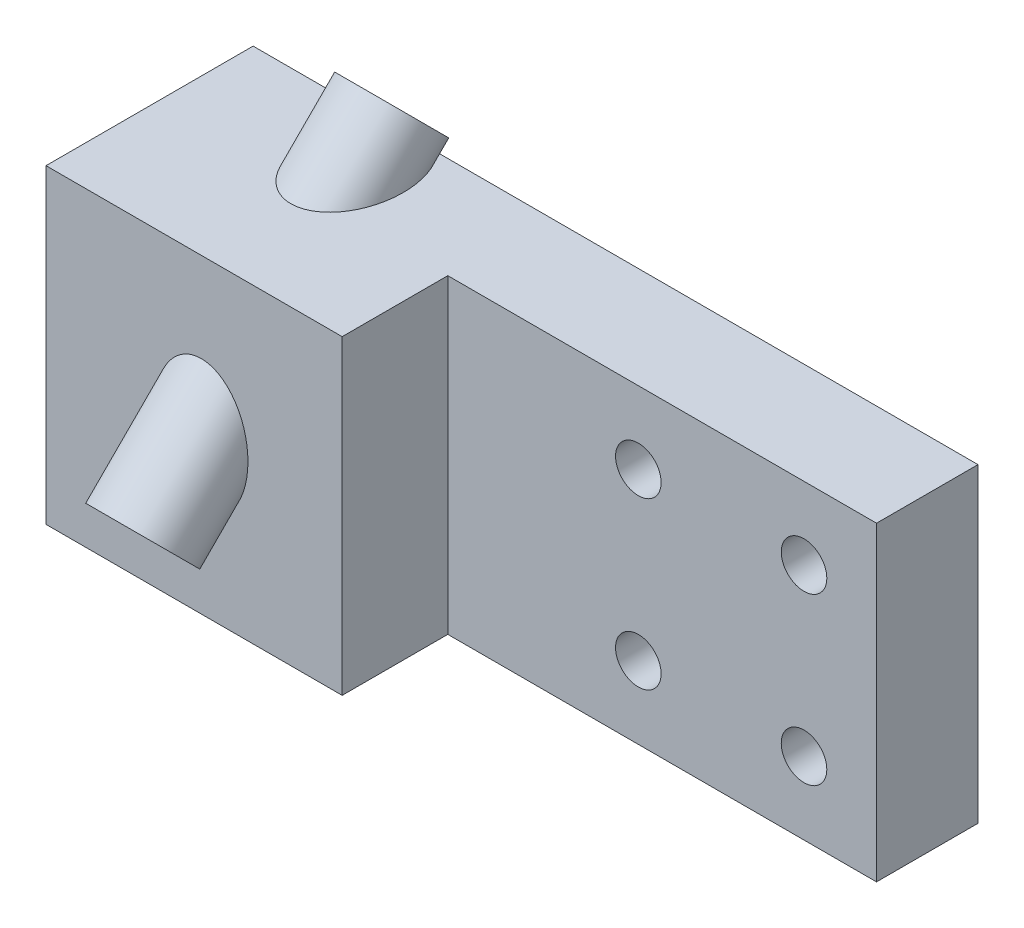
ISO-10303-21;
HEADER;
FILE_DESCRIPTION(('STEP AP214'),'2;1');
FILE_NAME('part.step','',(''),(''),'','','');
FILE_SCHEMA(('AUTOMOTIVE_DESIGN { 1 0 10303 214 1 1 1 1 }'));
ENDSEC;
DATA;
#1=APPLICATION_CONTEXT('core data for automotive mechanical design processes');
#2=APPLICATION_PROTOCOL_DEFINITION('international standard','automotive_design',2000,#1);
#3=PRODUCT_CONTEXT('',#1,'mechanical');
#4=PRODUCT('Part','Part','',(#3));
#5=PRODUCT_RELATED_PRODUCT_CATEGORY('part','',(#4));
#6=PRODUCT_DEFINITION_FORMATION('','',#4);
#7=PRODUCT_DEFINITION_CONTEXT('part definition',#1,'design');
#8=PRODUCT_DEFINITION('design','',#6,#7);
#9=PRODUCT_DEFINITION_SHAPE('','',#8);
#10=(LENGTH_UNIT() NAMED_UNIT(*) SI_UNIT(.MILLI.,.METRE.));
#11=(NAMED_UNIT(*) PLANE_ANGLE_UNIT() SI_UNIT($,.RADIAN.));
#12=(NAMED_UNIT(*) SI_UNIT($,.STERADIAN.) SOLID_ANGLE_UNIT());
#13=UNCERTAINTY_MEASURE_WITH_UNIT(LENGTH_MEASURE(1.E-05),#10,'distance_accuracy_value','');
#14=(GEOMETRIC_REPRESENTATION_CONTEXT(3) GLOBAL_UNCERTAINTY_ASSIGNED_CONTEXT((#13)) GLOBAL_UNIT_ASSIGNED_CONTEXT((#10,
#11,#12)) REPRESENTATION_CONTEXT('',''));
#15=CARTESIAN_POINT('',(0.,0.,0.));
#16=DIRECTION('',(0.,0.,1.));
#17=DIRECTION('',(1.,0.,0.));
#18=AXIS2_PLACEMENT_3D('',#15,#16,#17);
#19=CARTESIAN_POINT('',(0.,0.,4.));
#20=DIRECTION('',(0.,0.,1.));
#21=DIRECTION('',(1.,0.,0.));
#22=AXIS2_PLACEMENT_3D('',#19,#20,#21);
#23=PLANE('',#22);
#24=CARTESIAN_POINT('',(7.5,-7.5,4.));
#25=DIRECTION('',(0.,0.,1.));
#26=DIRECTION('',(0.,-1.,0.));
#27=AXIS2_PLACEMENT_3D('',#24,#25,#26);
#28=ELLIPSE('',#27,3.18198051533947,2.25);
#29=CARTESIAN_POINT('',(7.5,-10.6819805153395,4.));
#30=VERTEX_POINT('',#29);
#31=EDGE_CURVE('E11',#30,#30,#28,.T.);
#32=ORIENTED_EDGE('',*,*,#31,.F.);
#33=EDGE_LOOP('',(#32));
#34=FACE_BOUND('',#33,.T.);
#35=DIRECTION('',(1.,0.,0.));
#36=VECTOR('',#35,1.);
#37=CARTESIAN_POINT('',(0.,-15.,4.));
#38=LINE('',#37,#36);
#39=CARTESIAN_POINT('',(0.,-15.,4.));
#40=VERTEX_POINT('',#39);
#41=CARTESIAN_POINT('',(14.3,-15.,4.));
#42=VERTEX_POINT('',#41);
#43=EDGE_CURVE('E119',#40,#42,#38,.T.);
#44=ORIENTED_EDGE('',*,*,#43,.T.);
#45=DIRECTION('',(0.,-1.,0.));
#46=VECTOR('',#45,1.);
#47=CARTESIAN_POINT('',(14.3,0.,4.));
#48=LINE('',#47,#46);
#49=CARTESIAN_POINT('',(14.3,0.,4.));
#50=VERTEX_POINT('',#49);
#51=EDGE_CURVE('E110',#50,#42,#48,.T.);
#52=ORIENTED_EDGE('',*,*,#51,.F.);
#53=DIRECTION('',(-1.,0.,0.));
#54=VECTOR('',#53,1.);
#55=CARTESIAN_POINT('',(0.,0.,4.));
#56=LINE('',#55,#54);
#57=CARTESIAN_POINT('',(0.,0.,4.));
#58=VERTEX_POINT('',#57);
#59=EDGE_CURVE('E128',#50,#58,#56,.T.);
#60=ORIENTED_EDGE('',*,*,#59,.T.);
#61=DIRECTION('',(0.,-1.,0.));
#62=VECTOR('',#61,1.);
#63=CARTESIAN_POINT('',(0.,0.,4.));
#64=LINE('',#63,#62);
#65=EDGE_CURVE('E129',#58,#40,#64,.T.);
#66=ORIENTED_EDGE('',*,*,#65,.T.);
#67=EDGE_LOOP('',(#44,#52,#60,#66));
#68=FACE_BOUND('',#67,.T.);
#69=ADVANCED_FACE('F41',(#34,#68),#23,.T.);
#70=CARTESIAN_POINT('',(0.,0.,4.));
#71=DIRECTION('',(1.,0.,0.));
#72=DIRECTION('',(0.,1.,0.));
#73=AXIS2_PLACEMENT_3D('',#70,#71,#72);
#74=PLANE('',#73);
#75=DIRECTION('',(0.,0.,-1.));
#76=VECTOR('',#75,1.);
#77=CARTESIAN_POINT('',(0.,0.,4.));
#78=LINE('',#77,#76);
#79=CARTESIAN_POINT('',(0.,0.,-6.));
#80=VERTEX_POINT('',#79);
#81=EDGE_CURVE('E135',#58,#80,#78,.T.);
#82=ORIENTED_EDGE('',*,*,#81,.T.);
#83=DIRECTION('',(0.,-1.,0.));
#84=VECTOR('',#83,1.);
#85=CARTESIAN_POINT('',(0.,0.,-6.));
#86=LINE('',#85,#84);
#87=CARTESIAN_POINT('',(0.,-15.,-6.));
#88=VERTEX_POINT('',#87);
#89=EDGE_CURVE('E158',#80,#88,#86,.T.);
#90=ORIENTED_EDGE('',*,*,#89,.T.);
#91=DIRECTION('',(0.,0.,-1.));
#92=VECTOR('',#91,1.);
#93=CARTESIAN_POINT('',(0.,-15.,4.));
#94=LINE('',#93,#92);
#95=EDGE_CURVE('E139',#40,#88,#94,.T.);
#96=ORIENTED_EDGE('',*,*,#95,.F.);
#97=ORIENTED_EDGE('',*,*,#65,.F.);
#98=EDGE_LOOP('',(#82,#90,#96,#97));
#99=FACE_BOUND('',#98,.T.);
#100=ADVANCED_FACE('F43',(#99),#74,.F.);
#101=CARTESIAN_POINT('',(0.,-15.,4.));
#102=DIRECTION('',(0.,1.,0.));
#103=DIRECTION('',(0.,0.,1.));
#104=AXIS2_PLACEMENT_3D('',#101,#102,#103);
#105=PLANE('',#104);
#106=DIRECTION('',(1.,0.,0.));
#107=VECTOR('',#106,1.);
#108=CARTESIAN_POINT('',(0.,-15.,-1.1));
#109=LINE('',#108,#107);
#110=CARTESIAN_POINT('',(14.3,-15.,-1.1));
#111=VERTEX_POINT('',#110);
#112=CARTESIAN_POINT('',(35.,-15.,-1.1));
#113=VERTEX_POINT('',#112);
#114=EDGE_CURVE('E124',#111,#113,#109,.T.);
#115=ORIENTED_EDGE('',*,*,#114,.F.);
#116=DIRECTION('',(0.,0.,-1.));
#117=VECTOR('',#116,1.);
#118=CARTESIAN_POINT('',(14.3,-15.,4.));
#119=LINE('',#118,#117);
#120=EDGE_CURVE('E111',#42,#111,#119,.T.);
#121=ORIENTED_EDGE('',*,*,#120,.F.);
#122=ORIENTED_EDGE('',*,*,#43,.F.);
#123=ORIENTED_EDGE('',*,*,#95,.T.);
#124=DIRECTION('',(1.,0.,0.));
#125=VECTOR('',#124,1.);
#126=CARTESIAN_POINT('',(0.,-15.,-6.));
#127=LINE('',#126,#125);
#128=CARTESIAN_POINT('',(35.,-15.,-6.));
#129=VERTEX_POINT('',#128);
#130=EDGE_CURVE('E186',#88,#129,#127,.T.);
#131=ORIENTED_EDGE('',*,*,#130,.T.);
#132=DIRECTION('',(0.,0.,1.));
#133=VECTOR('',#132,1.);
#134=CARTESIAN_POINT('',(35.,-15.,-6.));
#135=LINE('',#134,#133);
#136=EDGE_CURVE('E178',#129,#113,#135,.T.);
#137=ORIENTED_EDGE('',*,*,#136,.T.);
#138=EDGE_LOOP('',(#115,#121,#122,#123,#131,#137));
#139=FACE_BOUND('',#138,.T.);
#140=ADVANCED_FACE('F118',(#139),#105,.F.);
#141=CARTESIAN_POINT('',(0.,0.,4.));
#142=DIRECTION('',(0.,-1.,0.));
#143=DIRECTION('',(0.,0.,-1.));
#144=AXIS2_PLACEMENT_3D('',#141,#142,#143);
#145=PLANE('',#144);
#146=DIRECTION('',(0.,0.,1.));
#147=VECTOR('',#146,1.);
#148=CARTESIAN_POINT('',(14.3,0.,4.));
#149=LINE('',#148,#147);
#150=CARTESIAN_POINT('',(14.3,0.,-1.1));
#151=VERTEX_POINT('',#150);
#152=EDGE_CURVE('E113',#151,#50,#149,.T.);
#153=ORIENTED_EDGE('',*,*,#152,.F.);
#154=DIRECTION('',(1.,0.,0.));
#155=VECTOR('',#154,1.);
#156=CARTESIAN_POINT('',(0.,0.,-1.1));
#157=LINE('',#156,#155);
#158=CARTESIAN_POINT('',(35.,0.,-1.1));
#159=VERTEX_POINT('',#158);
#160=EDGE_CURVE('E150',#151,#159,#157,.T.);
#161=ORIENTED_EDGE('',*,*,#160,.T.);
#162=DIRECTION('',(0.,0.,1.));
#163=VECTOR('',#162,1.);
#164=CARTESIAN_POINT('',(35.,0.,-6.));
#165=LINE('',#164,#163);
#166=CARTESIAN_POINT('',(35.,0.,-6.));
#167=VERTEX_POINT('',#166);
#168=EDGE_CURVE('E133',#167,#159,#165,.T.);
#169=ORIENTED_EDGE('',*,*,#168,.F.);
#170=DIRECTION('',(-1.,0.,0.));
#171=VECTOR('',#170,1.);
#172=CARTESIAN_POINT('',(0.,0.,-6.));
#173=LINE('',#172,#171);
#174=CARTESIAN_POINT('',(8.89194109070747,0.,-6.));
#175=VERTEX_POINT('',#174);
#176=EDGE_CURVE('E167',#167,#175,#173,.T.);
#177=ORIENTED_EDGE('',*,*,#176,.T.);
#178=CARTESIAN_POINT('',(7.5,0.,-3.49999999999997));
#179=DIRECTION('',(0.,-1.,0.));
#180=DIRECTION('',(0.,0.,1.));
#181=AXIS2_PLACEMENT_3D('',#178,#179,#180);
#182=ELLIPSE('',#181,3.18198051533946,2.25);
#183=CARTESIAN_POINT('',(6.10805890929252,0.,-6.));
#184=VERTEX_POINT('',#183);
#185=EDGE_CURVE('E57',#175,#184,#182,.T.);
#186=ORIENTED_EDGE('',*,*,#185,.T.);
#187=EDGE_CURVE('E175',#184,#80,#173,.T.);
#188=ORIENTED_EDGE('',*,*,#187,.T.);
#189=ORIENTED_EDGE('',*,*,#81,.F.);
#190=ORIENTED_EDGE('',*,*,#59,.F.);
#191=EDGE_LOOP('',(#153,#161,#169,#177,#186,#188,#189,#190));
#192=FACE_BOUND('',#191,.T.);
#193=ADVANCED_FACE('F172',(#192),#145,.F.);
#194=CARTESIAN_POINT('',(35.,0.,-6.));
#195=DIRECTION('',(1.,0.,0.));
#196=DIRECTION('',(0.,0.,-1.));
#197=AXIS2_PLACEMENT_3D('',#194,#195,#196);
#198=PLANE('',#197);
#199=DIRECTION('',(0.,-1.,0.));
#200=VECTOR('',#199,1.);
#201=CARTESIAN_POINT('',(35.,14.,-1.1));
#202=LINE('',#201,#200);
#203=EDGE_CURVE('E159',#159,#113,#202,.T.);
#204=ORIENTED_EDGE('',*,*,#203,.T.);
#205=ORIENTED_EDGE('',*,*,#136,.F.);
#206=DIRECTION('',(0.,1.,0.));
#207=VECTOR('',#206,1.);
#208=CARTESIAN_POINT('',(35.,0.,-6.));
#209=LINE('',#208,#207);
#210=EDGE_CURVE('E179',#129,#167,#209,.T.);
#211=ORIENTED_EDGE('',*,*,#210,.T.);
#212=ORIENTED_EDGE('',*,*,#168,.T.);
#213=EDGE_LOOP('',(#204,#205,#211,#212));
#214=FACE_BOUND('',#213,.T.);
#215=ADVANCED_FACE('F187',(#214),#198,.T.);
#216=CARTESIAN_POINT('',(0.,0.,-6.));
#217=DIRECTION('',(0.,0.,1.));
#218=DIRECTION('',(1.,0.,0.));
#219=AXIS2_PLACEMENT_3D('',#216,#217,#218);
#220=PLANE('',#219);
#221=CARTESIAN_POINT('',(23.5,-3.50000000000005,-6.));
#222=DIRECTION('',(0.,0.,1.));
#223=DIRECTION('',(1.,0.,0.));
#224=AXIS2_PLACEMENT_3D('',#221,#222,#223);
#225=CIRCLE('',#224,1.1);
#226=CARTESIAN_POINT('',(24.6,-3.50000000000005,-6.));
#227=VERTEX_POINT('',#226);
#228=EDGE_CURVE('E152',#227,#227,#225,.T.);
#229=ORIENTED_EDGE('',*,*,#228,.T.);
#230=EDGE_LOOP('',(#229));
#231=FACE_BOUND('',#230,.T.);
#232=CARTESIAN_POINT('',(23.5000000000001,-11.5000000000001,-6.));
#233=DIRECTION('',(0.,0.,1.));
#234=DIRECTION('',(1.,0.,0.));
#235=AXIS2_PLACEMENT_3D('',#232,#233,#234);
#236=CIRCLE('',#235,1.1);
#237=CARTESIAN_POINT('',(24.6000000000001,-11.5000000000001,-6.));
#238=VERTEX_POINT('',#237);
#239=EDGE_CURVE('E148',#238,#238,#236,.T.);
#240=ORIENTED_EDGE('',*,*,#239,.T.);
#241=EDGE_LOOP('',(#240));
#242=FACE_BOUND('',#241,.T.);
#243=CARTESIAN_POINT('',(31.5000000000001,-11.5,-6.));
#244=DIRECTION('',(0.,0.,1.));
#245=DIRECTION('',(1.,0.,0.));
#246=AXIS2_PLACEMENT_3D('',#243,#244,#245);
#247=CIRCLE('',#246,1.1);
#248=CARTESIAN_POINT('',(32.6000000000001,-11.5,-6.));
#249=VERTEX_POINT('',#248);
#250=EDGE_CURVE('E147',#249,#249,#247,.T.);
#251=ORIENTED_EDGE('',*,*,#250,.T.);
#252=EDGE_LOOP('',(#251));
#253=FACE_BOUND('',#252,.T.);
#254=CARTESIAN_POINT('',(31.5,-3.5,-6.));
#255=DIRECTION('',(0.,0.,1.));
#256=DIRECTION('',(1.,0.,0.));
#257=AXIS2_PLACEMENT_3D('',#254,#255,#256);
#258=CIRCLE('',#257,1.1);
#259=CARTESIAN_POINT('',(32.6,-3.5,-6.));
#260=VERTEX_POINT('',#259);
#261=EDGE_CURVE('E141',#260,#260,#258,.T.);
#262=ORIENTED_EDGE('',*,*,#261,.T.);
#263=EDGE_LOOP('',(#262));
#264=FACE_BOUND('',#263,.T.);
#265=ORIENTED_EDGE('',*,*,#187,.F.);
#266=CARTESIAN_POINT('',(7.5,2.50000000000003,-6.));
#267=DIRECTION('',(0.,0.,1.));
#268=DIRECTION('',(0.,-1.,0.));
#269=AXIS2_PLACEMENT_3D('',#266,#267,#268);
#270=ELLIPSE('',#269,3.18198051533947,2.25);
#271=EDGE_CURVE('E44',#184,#175,#270,.T.);
#272=ORIENTED_EDGE('',*,*,#271,.T.);
#273=ORIENTED_EDGE('',*,*,#176,.F.);
#274=ORIENTED_EDGE('',*,*,#210,.F.);
#275=ORIENTED_EDGE('',*,*,#130,.F.);
#276=ORIENTED_EDGE('',*,*,#89,.F.);
#277=EDGE_LOOP('',(#265,#272,#273,#274,#275,#276));
#278=FACE_BOUND('',#277,.T.);
#279=ADVANCED_FACE('F166',(#231,#242,#253,#264,#278),#220,.F.);
#280=CARTESIAN_POINT('',(31.5,-3.5,-25.));
#281=DIRECTION('',(0.,0.,1.));
#282=DIRECTION('',(1.,0.,0.));
#283=AXIS2_PLACEMENT_3D('',#280,#281,#282);
#284=CYLINDRICAL_SURFACE('',#283,1.1);
#285=CARTESIAN_POINT('',(31.5,-3.5,-1.1));
#286=DIRECTION('',(0.,0.,-1.));
#287=DIRECTION('',(-1.,0.,0.));
#288=AXIS2_PLACEMENT_3D('',#285,#286,#287);
#289=CIRCLE('',#288,1.1);
#290=CARTESIAN_POINT('',(30.4,-3.5,-1.1));
#291=VERTEX_POINT('',#290);
#292=EDGE_CURVE('E191',#291,#291,#289,.F.);
#293=ORIENTED_EDGE('',*,*,#292,.T.);
#294=EDGE_LOOP('',(#293));
#295=FACE_BOUND('',#294,.T.);
#296=ORIENTED_EDGE('',*,*,#261,.F.);
#297=EDGE_LOOP('',(#296));
#298=FACE_BOUND('',#297,.T.);
#299=ADVANCED_FACE('F285',(#295,#298),#284,.F.);
#300=CARTESIAN_POINT('',(31.5000000000001,-11.5,-25.));
#301=DIRECTION('',(0.,0.,1.));
#302=DIRECTION('',(1.,0.,0.));
#303=AXIS2_PLACEMENT_3D('',#300,#301,#302);
#304=CYLINDRICAL_SURFACE('',#303,1.1);
#305=CARTESIAN_POINT('',(31.5000000000001,-11.5,-1.1));
#306=DIRECTION('',(0.,0.,-1.));
#307=DIRECTION('',(-1.,0.,0.));
#308=AXIS2_PLACEMENT_3D('',#305,#306,#307);
#309=CIRCLE('',#308,1.1);
#310=CARTESIAN_POINT('',(30.4000000000001,-11.5,-1.1));
#311=VERTEX_POINT('',#310);
#312=EDGE_CURVE('E200',#311,#311,#309,.F.);
#313=ORIENTED_EDGE('',*,*,#312,.T.);
#314=EDGE_LOOP('',(#313));
#315=FACE_BOUND('',#314,.T.);
#316=ORIENTED_EDGE('',*,*,#250,.F.);
#317=EDGE_LOOP('',(#316));
#318=FACE_BOUND('',#317,.T.);
#319=ADVANCED_FACE('F279',(#315,#318),#304,.F.);
#320=CARTESIAN_POINT('',(23.5000000000001,-11.5000000000001,-25.));
#321=DIRECTION('',(0.,0.,1.));
#322=DIRECTION('',(1.,0.,0.));
#323=AXIS2_PLACEMENT_3D('',#320,#321,#322);
#324=CYLINDRICAL_SURFACE('',#323,1.1);
#325=CARTESIAN_POINT('',(23.5000000000001,-11.5000000000001,-1.1));
#326=DIRECTION('',(0.,0.,-1.));
#327=DIRECTION('',(-1.,0.,0.));
#328=AXIS2_PLACEMENT_3D('',#325,#326,#327);
#329=CIRCLE('',#328,1.1);
#330=CARTESIAN_POINT('',(22.4000000000001,-11.5000000000001,-1.1));
#331=VERTEX_POINT('',#330);
#332=EDGE_CURVE('E157',#331,#331,#329,.F.);
#333=ORIENTED_EDGE('',*,*,#332,.T.);
#334=EDGE_LOOP('',(#333));
#335=FACE_BOUND('',#334,.T.);
#336=ORIENTED_EDGE('',*,*,#239,.F.);
#337=EDGE_LOOP('',(#336));
#338=FACE_BOUND('',#337,.T.);
#339=ADVANCED_FACE('F281',(#335,#338),#324,.F.);
#340=CARTESIAN_POINT('',(23.5,-3.50000000000005,-25.));
#341=DIRECTION('',(0.,0.,1.));
#342=DIRECTION('',(1.,0.,0.));
#343=AXIS2_PLACEMENT_3D('',#340,#341,#342);
#344=CYLINDRICAL_SURFACE('',#343,1.1);
#345=CARTESIAN_POINT('',(23.5,-3.50000000000005,-1.1));
#346=DIRECTION('',(0.,0.,-1.));
#347=DIRECTION('',(-1.,0.,0.));
#348=AXIS2_PLACEMENT_3D('',#345,#346,#347);
#349=CIRCLE('',#348,1.1);
#350=CARTESIAN_POINT('',(22.4,-3.50000000000005,-1.1));
#351=VERTEX_POINT('',#350);
#352=EDGE_CURVE('E160',#351,#351,#349,.F.);
#353=ORIENTED_EDGE('',*,*,#352,.T.);
#354=EDGE_LOOP('',(#353));
#355=FACE_BOUND('',#354,.T.);
#356=ORIENTED_EDGE('',*,*,#228,.F.);
#357=EDGE_LOOP('',(#356));
#358=FACE_BOUND('',#357,.T.);
#359=ADVANCED_FACE('F277',(#355,#358),#344,.F.);
#360=CARTESIAN_POINT('',(0.,14.,-1.1));
#361=DIRECTION('',(0.,0.,-1.));
#362=DIRECTION('',(-1.,0.,0.));
#363=AXIS2_PLACEMENT_3D('',#360,#361,#362);
#364=PLANE('',#363);
#365=ORIENTED_EDGE('',*,*,#312,.F.);
#366=EDGE_LOOP('',(#365));
#367=FACE_BOUND('',#366,.T.);
#368=ORIENTED_EDGE('',*,*,#352,.F.);
#369=EDGE_LOOP('',(#368));
#370=FACE_BOUND('',#369,.T.);
#371=ORIENTED_EDGE('',*,*,#332,.F.);
#372=EDGE_LOOP('',(#371));
#373=FACE_BOUND('',#372,.T.);
#374=ORIENTED_EDGE('',*,*,#292,.F.);
#375=EDGE_LOOP('',(#374));
#376=FACE_BOUND('',#375,.T.);
#377=ORIENTED_EDGE('',*,*,#160,.F.);
#378=DIRECTION('',(0.,1.,0.));
#379=VECTOR('',#378,1.);
#380=CARTESIAN_POINT('',(14.3,0.,-1.1));
#381=LINE('',#380,#379);
#382=EDGE_CURVE('E123',#111,#151,#381,.T.);
#383=ORIENTED_EDGE('',*,*,#382,.F.);
#384=ORIENTED_EDGE('',*,*,#114,.T.);
#385=ORIENTED_EDGE('',*,*,#203,.F.);
#386=EDGE_LOOP('',(#377,#383,#384,#385));
#387=FACE_BOUND('',#386,.T.);
#388=ADVANCED_FACE('F272',(#367,#370,#373,#376,#387),#364,.F.);
#389=CARTESIAN_POINT('',(7.5,1.69238815542513,-5.1923881554251));
#390=DIRECTION('',(0.,-0.707106781186549,0.707106781186546));
#391=DIRECTION('',(0.,-0.707106781186546,-0.707106781186549));
#392=AXIS2_PLACEMENT_3D('',#389,#390,#391);
#393=PLANE('',#392);
#394=CARTESIAN_POINT('',(7.5,1.69238815542513,-5.1923881554251));
#395=DIRECTION('',(0.,-0.707106781186549,0.707106781186546));
#396=DIRECTION('',(0.,-0.707106781186546,-0.707106781186549));
#397=AXIS2_PLACEMENT_3D('',#394,#395,#396);
#398=CIRCLE('',#397,1.5);
#399=CARTESIAN_POINT('',(7.5,0.631727983645316,-6.25304832720492));
#400=VERTEX_POINT('',#399);
#401=EDGE_CURVE('E212',#400,#400,#398,.T.);
#402=ORIENTED_EDGE('',*,*,#401,.T.);
#403=EDGE_LOOP('',(#402));
#404=FACE_BOUND('',#403,.T.);
#405=CARTESIAN_POINT('',(7.5,1.69238815542513,-5.1923881554251));
#406=DIRECTION('',(0.,-0.707106781186549,0.707106781186546));
#407=DIRECTION('',(0.,-0.707106781186546,-0.707106781186549));
#408=AXIS2_PLACEMENT_3D('',#405,#406,#407);
#409=CIRCLE('',#408,2.25);
#410=CARTESIAN_POINT('',(7.5,0.101397897755405,-6.78337841309484));
#411=VERTEX_POINT('',#410);
#412=EDGE_CURVE('E206',#411,#411,#409,.T.);
#413=ORIENTED_EDGE('',*,*,#412,.F.);
#414=EDGE_LOOP('',(#413));
#415=FACE_BOUND('',#414,.T.);
#416=ADVANCED_FACE('F247',(#404,#415),#393,.F.);
#417=CARTESIAN_POINT('',(7.5,1.69238815542513,-5.1923881554251));
#418=DIRECTION('',(0.,-0.707106781186549,0.707106781186546));
#419=DIRECTION('',(0.,-0.707106781186546,-0.707106781186549));
#420=AXIS2_PLACEMENT_3D('',#417,#418,#419);
#421=CYLINDRICAL_SURFACE('',#420,2.25);
#422=ORIENTED_EDGE('',*,*,#412,.T.);
#423=EDGE_LOOP('',(#422));
#424=FACE_BOUND('',#423,.T.);
#425=ORIENTED_EDGE('',*,*,#185,.F.);
#426=ORIENTED_EDGE('',*,*,#271,.F.);
#427=EDGE_LOOP('',(#425,#426));
#428=FACE_BOUND('',#427,.T.);
#429=ADVANCED_FACE('F241',(#424,#428),#421,.T.);
#430=DIRECTION('',(1.,0.,0.));
#431=VECTOR('',#430,1.);
#432=CARTESIAN_POINT('',(7.5,-7.5,4.));
#433=LINE('',#432,#431);
#434=CARTESIAN_POINT('',(6.,-7.5,4.));
#435=VERTEX_POINT('',#434);
#436=CARTESIAN_POINT('',(9.,-7.5,4.));
#437=VERTEX_POINT('',#436);
#438=EDGE_CURVE('E145',#435,#437,#433,.T.);
#439=ORIENTED_EDGE('',*,*,#438,.F.);
#440=CARTESIAN_POINT('',(7.5,-7.5,4.));
#441=DIRECTION('',(0.,0.,1.));
#442=DIRECTION('',(0.,-1.,0.));
#443=AXIS2_PLACEMENT_3D('',#440,#441,#442);
#444=ELLIPSE('',#443,2.12132034355964,1.5);
#445=EDGE_CURVE('E64',#435,#437,#444,.T.);
#446=ORIENTED_EDGE('',*,*,#445,.T.);
#447=EDGE_LOOP('',(#439,#446));
#448=FACE_BOUND('',#447,.T.);
#449=ADVANCED_FACE('F235',(#448),#23,.T.);
#450=CARTESIAN_POINT('',(7.5,-7.5,4.));
#451=DIRECTION('',(0.,-0.707106781186549,0.707106781186546));
#452=DIRECTION('',(0.,-0.707106781186546,-0.707106781186549));
#453=AXIS2_PLACEMENT_3D('',#450,#451,#452);
#454=PLANE('',#453);
#455=CARTESIAN_POINT('',(7.5,-7.5,4.));
#456=DIRECTION('',(0.,-0.707106781186549,0.707106781186546));
#457=DIRECTION('',(0.,-0.707106781186546,-0.707106781186549));
#458=AXIS2_PLACEMENT_3D('',#455,#456,#457);
#459=CIRCLE('',#458,1.5);
#460=EDGE_CURVE('E202',#435,#437,#459,.T.);
#461=ORIENTED_EDGE('',*,*,#460,.F.);
#462=ORIENTED_EDGE('',*,*,#438,.T.);
#463=EDGE_LOOP('',(#461,#462));
#464=FACE_BOUND('',#463,.T.);
#465=ADVANCED_FACE('F239',(#464),#454,.F.);
#466=CARTESIAN_POINT('',(7.5,1.69238815542513,-5.1923881554251));
#467=DIRECTION('',(0.,-0.707106781186549,0.707106781186546));
#468=DIRECTION('',(0.,-0.707106781186546,-0.707106781186549));
#469=AXIS2_PLACEMENT_3D('',#466,#467,#468);
#470=CYLINDRICAL_SURFACE('',#469,1.5);
#471=ORIENTED_EDGE('',*,*,#460,.T.);
#472=ORIENTED_EDGE('',*,*,#445,.F.);
#473=EDGE_LOOP('',(#471,#472));
#474=FACE_BOUND('',#473,.T.);
#475=ORIENTED_EDGE('',*,*,#401,.F.);
#476=EDGE_LOOP('',(#475));
#477=FACE_BOUND('',#476,.T.);
#478=CARTESIAN_POINT('',(7.5,-10.3284271247462,6.82842712474618));
#479=DIRECTION('',(0.,-0.707106781186549,0.707106781186546));
#480=DIRECTION('',(0.,-0.707106781186546,-0.707106781186549));
#481=AXIS2_PLACEMENT_3D('',#478,#479,#480);
#482=CIRCLE('',#481,1.5);
#483=CARTESIAN_POINT('',(7.5,-11.389087296526,5.76776695296636));
#484=VERTEX_POINT('',#483);
#485=EDGE_CURVE('E220',#484,#484,#482,.T.);
#486=ORIENTED_EDGE('',*,*,#485,.T.);
#487=EDGE_LOOP('',(#486));
#488=FACE_BOUND('',#487,.T.);
#489=ADVANCED_FACE('F246',(#474,#477,#488),#470,.F.);
#490=ORIENTED_EDGE('',*,*,#31,.T.);
#491=EDGE_LOOP('',(#490));
#492=FACE_BOUND('',#491,.T.);
#493=CARTESIAN_POINT('',(7.5,-10.3284271247462,6.82842712474618));
#494=DIRECTION('',(0.,-0.707106781186549,0.707106781186546));
#495=DIRECTION('',(0.,-0.707106781186546,-0.707106781186549));
#496=AXIS2_PLACEMENT_3D('',#493,#494,#495);
#497=CIRCLE('',#496,2.25);
#498=CARTESIAN_POINT('',(7.5,-11.9194173824159,5.23743686707645));
#499=VERTEX_POINT('',#498);
#500=EDGE_CURVE('E211',#499,#499,#497,.T.);
#501=ORIENTED_EDGE('',*,*,#500,.F.);
#502=EDGE_LOOP('',(#501));
#503=FACE_BOUND('',#502,.T.);
#504=ADVANCED_FACE('F252',(#492,#503),#421,.T.);
#505=CARTESIAN_POINT('',(7.5,-10.3284271247462,6.82842712474618));
#506=DIRECTION('',(0.,-0.707106781186549,0.707106781186546));
#507=DIRECTION('',(0.,-0.707106781186546,-0.707106781186549));
#508=AXIS2_PLACEMENT_3D('',#505,#506,#507);
#509=PLANE('',#508);
#510=ORIENTED_EDGE('',*,*,#500,.T.);
#511=EDGE_LOOP('',(#510));
#512=FACE_BOUND('',#511,.T.);
#513=ORIENTED_EDGE('',*,*,#485,.F.);
#514=EDGE_LOOP('',(#513));
#515=FACE_BOUND('',#514,.T.);
#516=ADVANCED_FACE('F258',(#512,#515),#509,.T.);
#517=CARTESIAN_POINT('',(14.3,0.,0.));
#518=DIRECTION('',(1.,0.,0.));
#519=DIRECTION('',(0.,0.,-1.));
#520=AXIS2_PLACEMENT_3D('',#517,#518,#519);
#521=PLANE('',#520);
#522=ORIENTED_EDGE('',*,*,#51,.T.);
#523=ORIENTED_EDGE('',*,*,#120,.T.);
#524=ORIENTED_EDGE('',*,*,#382,.T.);
#525=ORIENTED_EDGE('',*,*,#152,.T.);
#526=EDGE_LOOP('',(#522,#523,#524,#525));
#527=FACE_BOUND('',#526,.T.);
#528=ADVANCED_FACE('F107',(#527),#521,.T.);
#529=CLOSED_SHELL('',(#69,#100,#140,#193,#215,#279,#299,#319,#339,#359,#388,#416,#429,#449,#465,
#489,#504,#516,#528));
#530=MANIFOLD_SOLID_BREP('B2',#529);
#531=ADVANCED_BREP_SHAPE_REPRESENTATION('',(#18,#530),#14);
#532=SHAPE_DEFINITION_REPRESENTATION(#9,#531);
ENDSEC;
END-ISO-10303-21;
